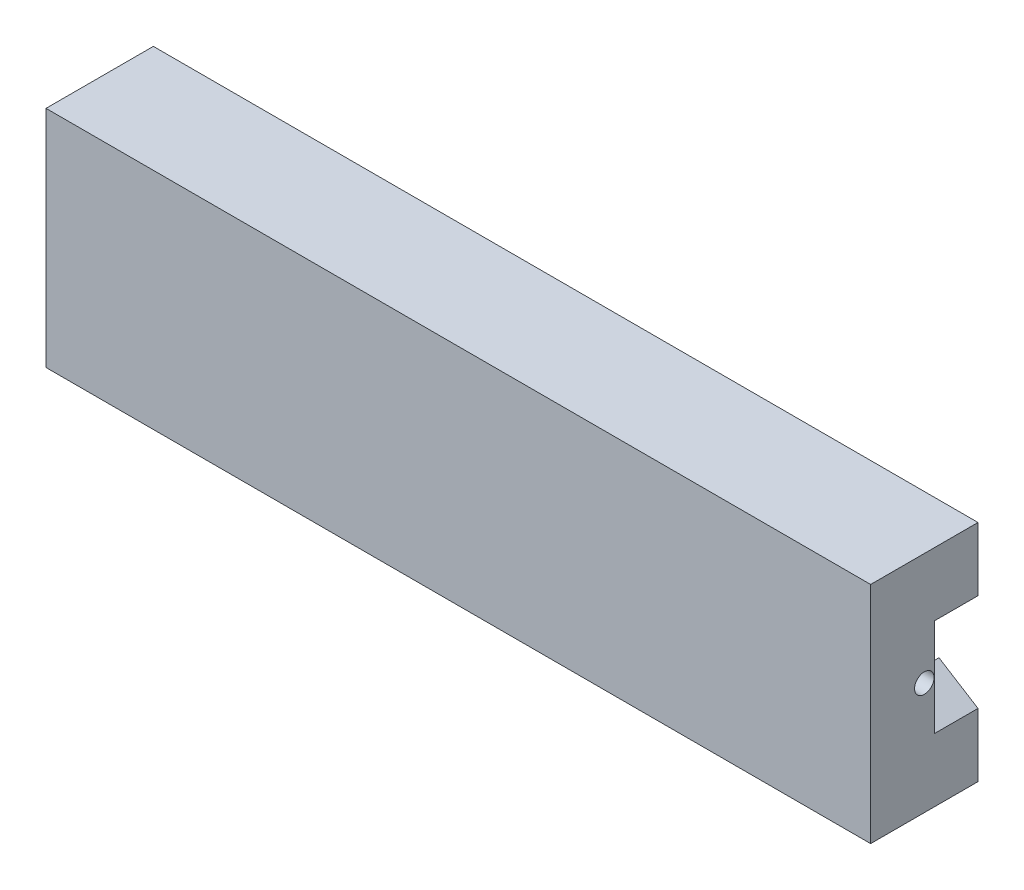
ISO-10303-21;
HEADER;
FILE_DESCRIPTION(('STEP AP214'),'2;1');
FILE_NAME('part.step','',(''),(''),'','','');
FILE_SCHEMA(('AUTOMOTIVE_DESIGN { 1 0 10303 214 1 1 1 1 }'));
ENDSEC;
DATA;
#1=APPLICATION_CONTEXT('core data for automotive mechanical design processes');
#2=APPLICATION_PROTOCOL_DEFINITION('international standard','automotive_design',2000,#1);
#3=PRODUCT_CONTEXT('',#1,'mechanical');
#4=PRODUCT('Part','Part','',(#3));
#5=PRODUCT_RELATED_PRODUCT_CATEGORY('part','',(#4));
#6=PRODUCT_DEFINITION_FORMATION('','',#4);
#7=PRODUCT_DEFINITION_CONTEXT('part definition',#1,'design');
#8=PRODUCT_DEFINITION('design','',#6,#7);
#9=PRODUCT_DEFINITION_SHAPE('','',#8);
#10=(LENGTH_UNIT() NAMED_UNIT(*) SI_UNIT(.MILLI.,.METRE.));
#11=(NAMED_UNIT(*) PLANE_ANGLE_UNIT() SI_UNIT($,.RADIAN.));
#12=(NAMED_UNIT(*) SI_UNIT($,.STERADIAN.) SOLID_ANGLE_UNIT());
#13=UNCERTAINTY_MEASURE_WITH_UNIT(LENGTH_MEASURE(1.E-05),#10,'distance_accuracy_value','');
#14=(GEOMETRIC_REPRESENTATION_CONTEXT(3) GLOBAL_UNCERTAINTY_ASSIGNED_CONTEXT((#13)) GLOBAL_UNIT_ASSIGNED_CONTEXT((#10,
#11,#12)) REPRESENTATION_CONTEXT('',''));
#15=CARTESIAN_POINT('',(0.,0.,0.));
#16=DIRECTION('',(0.,0.,1.));
#17=DIRECTION('',(1.,0.,0.));
#18=AXIS2_PLACEMENT_3D('',#15,#16,#17);
#19=CARTESIAN_POINT('',(38.25,7.5,-2.));
#20=DIRECTION('',(-1.,0.,0.));
#21=DIRECTION('',(0.,0.,1.));
#22=AXIS2_PLACEMENT_3D('',#19,#20,#21);
#23=PLANE('',#22);
#24=DIRECTION('',(0.,0.,-1.));
#25=VECTOR('',#24,1.);
#26=CARTESIAN_POINT('',(38.25,2.5,11.250329614269));
#27=LINE('',#26,#25);
#28=CARTESIAN_POINT('',(38.25,2.5,0.));
#29=VERTEX_POINT('',#28);
#30=CARTESIAN_POINT('',(38.25,2.5,-1.55));
#31=VERTEX_POINT('',#30);
#32=EDGE_CURVE('E541',#29,#31,#27,.T.);
#33=ORIENTED_EDGE('',*,*,#32,.F.);
#34=DIRECTION('',(0.,-1.,0.));
#35=VECTOR('',#34,1.);
#36=CARTESIAN_POINT('',(38.25,7.5,0.));
#37=LINE('',#36,#35);
#38=CARTESIAN_POINT('',(38.25,7.5,0.));
#39=VERTEX_POINT('',#38);
#40=EDGE_CURVE('E360',#39,#29,#37,.T.);
#41=ORIENTED_EDGE('',*,*,#40,.F.);
#42=DIRECTION('',(0.,0.,1.));
#43=VECTOR('',#42,1.);
#44=CARTESIAN_POINT('',(38.25,7.5,-2.));
#45=LINE('',#44,#43);
#46=CARTESIAN_POINT('',(38.25,7.5,-1.55));
#47=VERTEX_POINT('',#46);
#48=EDGE_CURVE('E365',#47,#39,#45,.T.);
#49=ORIENTED_EDGE('',*,*,#48,.F.);
#50=DIRECTION('',(0.,-1.,0.));
#51=VECTOR('',#50,1.);
#52=CARTESIAN_POINT('',(38.25,7.5,-1.55));
#53=LINE('',#52,#51);
#54=EDGE_CURVE('E309',#47,#31,#53,.T.);
#55=ORIENTED_EDGE('',*,*,#54,.T.);
#56=EDGE_LOOP('',(#33,#41,#49,#55));
#57=FACE_BOUND('',#56,.T.);
#58=ADVANCED_FACE('F38',(#57),#23,.T.);
#59=CARTESIAN_POINT('',(38.75,0.,0.48));
#60=DIRECTION('',(1.,0.,0.));
#61=DIRECTION('',(0.,0.,-1.));
#62=AXIS2_PLACEMENT_3D('',#59,#60,#61);
#63=PLANE('',#62);
#64=DIRECTION('',(0.,-1.,0.));
#65=VECTOR('',#64,1.);
#66=CARTESIAN_POINT('',(38.75,0.,0.));
#67=LINE('',#66,#65);
#68=CARTESIAN_POINT('',(38.75,8.,0.));
#69=VERTEX_POINT('',#68);
#70=CARTESIAN_POINT('',(38.75,2.8125,0.));
#71=VERTEX_POINT('',#70);
#72=EDGE_CURVE('E398',#69,#71,#67,.T.);
#73=ORIENTED_EDGE('',*,*,#72,.T.);
#74=DIRECTION('',(0.,0.,1.));
#75=VECTOR('',#74,1.);
#76=CARTESIAN_POINT('',(38.75,2.8125,0.48));
#77=LINE('',#76,#75);
#78=CARTESIAN_POINT('',(38.75,2.8125,0.48));
#79=VERTEX_POINT('',#78);
#80=EDGE_CURVE('E505',#71,#79,#77,.T.);
#81=ORIENTED_EDGE('',*,*,#80,.T.);
#82=DIRECTION('',(0.,-1.,0.));
#83=VECTOR('',#82,1.);
#84=CARTESIAN_POINT('',(38.75,0.,0.48));
#85=LINE('',#84,#83);
#86=CARTESIAN_POINT('',(38.75,8.,0.48));
#87=VERTEX_POINT('',#86);
#88=EDGE_CURVE('E385',#87,#79,#85,.T.);
#89=ORIENTED_EDGE('',*,*,#88,.F.);
#90=DIRECTION('',(0.,0.,-1.));
#91=VECTOR('',#90,1.);
#92=CARTESIAN_POINT('',(38.75,8.,0.48));
#93=LINE('',#92,#91);
#94=EDGE_CURVE('E394',#87,#69,#93,.T.);
#95=ORIENTED_EDGE('',*,*,#94,.T.);
#96=EDGE_LOOP('',(#73,#81,#89,#95));
#97=FACE_BOUND('',#96,.T.);
#98=ADVANCED_FACE('F554',(#97),#63,.F.);
#99=CARTESIAN_POINT('',(38.75,8.,-1.55));
#100=DIRECTION('',(1.,0.,0.));
#101=DIRECTION('',(0.,0.,-1.));
#102=AXIS2_PLACEMENT_3D('',#99,#100,#101);
#103=PLANE('',#102);
#104=DIRECTION('',(0.,-1.,0.));
#105=VECTOR('',#104,1.);
#106=CARTESIAN_POINT('',(38.75,8.,-2.));
#107=LINE('',#106,#105);
#108=CARTESIAN_POINT('',(38.75,8.,-2.));
#109=VERTEX_POINT('',#108);
#110=CARTESIAN_POINT('',(38.75,2.8125,-2.));
#111=VERTEX_POINT('',#110);
#112=EDGE_CURVE('E327',#109,#111,#107,.T.);
#113=ORIENTED_EDGE('',*,*,#112,.T.);
#114=DIRECTION('',(0.,0.,1.));
#115=VECTOR('',#114,1.);
#116=CARTESIAN_POINT('',(38.75,2.8125,-1.55));
#117=LINE('',#116,#115);
#118=CARTESIAN_POINT('',(38.75,2.8125,-1.55));
#119=VERTEX_POINT('',#118);
#120=EDGE_CURVE('E523',#111,#119,#117,.T.);
#121=ORIENTED_EDGE('',*,*,#120,.T.);
#122=DIRECTION('',(0.,-1.,0.));
#123=VECTOR('',#122,1.);
#124=CARTESIAN_POINT('',(38.75,8.,-1.55));
#125=LINE('',#124,#123);
#126=CARTESIAN_POINT('',(38.75,8.,-1.55));
#127=VERTEX_POINT('',#126);
#128=EDGE_CURVE('E313',#127,#119,#125,.T.);
#129=ORIENTED_EDGE('',*,*,#128,.F.);
#130=DIRECTION('',(0.,0.,-1.));
#131=VECTOR('',#130,1.);
#132=CARTESIAN_POINT('',(38.75,8.,-1.55));
#133=LINE('',#132,#131);
#134=EDGE_CURVE('E339',#127,#109,#133,.T.);
#135=ORIENTED_EDGE('',*,*,#134,.T.);
#136=EDGE_LOOP('',(#113,#121,#129,#135));
#137=FACE_BOUND('',#136,.T.);
#138=ADVANCED_FACE('F628',(#137),#103,.F.);
#139=CARTESIAN_POINT('',(38.25,7.5,-4.));
#140=DIRECTION('',(-1.,0.,0.));
#141=DIRECTION('',(0.,0.,1.));
#142=AXIS2_PLACEMENT_3D('',#139,#140,#141);
#143=PLANE('',#142);
#144=DIRECTION('',(0.,0.,-1.));
#145=VECTOR('',#144,1.);
#146=CARTESIAN_POINT('',(38.25,2.5,-4.));
#147=LINE('',#146,#145);
#148=CARTESIAN_POINT('',(38.25,2.5,-2.));
#149=VERTEX_POINT('',#148);
#150=CARTESIAN_POINT('',(38.25,2.5,-4.));
#151=VERTEX_POINT('',#150);
#152=EDGE_CURVE('E11',#149,#151,#147,.T.);
#153=ORIENTED_EDGE('',*,*,#152,.F.);
#154=DIRECTION('',(0.,-1.,0.));
#155=VECTOR('',#154,1.);
#156=CARTESIAN_POINT('',(38.25,7.5,-2.));
#157=LINE('',#156,#155);
#158=CARTESIAN_POINT('',(38.25,7.5,-2.));
#159=VERTEX_POINT('',#158);
#160=EDGE_CURVE('E483',#159,#149,#157,.T.);
#161=ORIENTED_EDGE('',*,*,#160,.F.);
#162=DIRECTION('',(0.,0.,1.));
#163=VECTOR('',#162,1.);
#164=CARTESIAN_POINT('',(38.25,7.5,-4.));
#165=LINE('',#164,#163);
#166=CARTESIAN_POINT('',(38.25,7.5,-4.));
#167=VERTEX_POINT('',#166);
#168=EDGE_CURVE('E493',#167,#159,#165,.T.);
#169=ORIENTED_EDGE('',*,*,#168,.F.);
#170=DIRECTION('',(0.,-1.,0.));
#171=VECTOR('',#170,1.);
#172=CARTESIAN_POINT('',(38.25,7.5,-4.));
#173=LINE('',#172,#171);
#174=EDGE_CURVE('E494',#167,#151,#173,.T.);
#175=ORIENTED_EDGE('',*,*,#174,.T.);
#176=EDGE_LOOP('',(#153,#161,#169,#175));
#177=FACE_BOUND('',#176,.T.);
#178=ADVANCED_FACE('F649',(#177),#143,.T.);
#179=CARTESIAN_POINT('',(38.25,-7.5,-2.));
#180=DIRECTION('',(0.,1.,0.));
#181=DIRECTION('',(-1.,0.,0.));
#182=AXIS2_PLACEMENT_3D('',#179,#180,#181);
#183=PLANE('',#182);
#184=DIRECTION('',(0.,0.,1.));
#185=VECTOR('',#184,1.);
#186=CARTESIAN_POINT('',(38.25,-7.5,-2.));
#187=LINE('',#186,#185);
#188=CARTESIAN_POINT('',(38.25,-7.5,-1.55));
#189=VERTEX_POINT('',#188);
#190=CARTESIAN_POINT('',(38.25,-7.5,0.));
#191=VERTEX_POINT('',#190);
#192=EDGE_CURVE('E363',#189,#191,#187,.T.);
#193=ORIENTED_EDGE('',*,*,#192,.F.);
#194=DIRECTION('',(-1.,0.,0.));
#195=VECTOR('',#194,1.);
#196=CARTESIAN_POINT('',(38.25,-7.5,-1.55));
#197=LINE('',#196,#195);
#198=CARTESIAN_POINT('',(-38.25,-7.50000000000001,-1.55));
#199=VERTEX_POINT('',#198);
#200=EDGE_CURVE('E300',#189,#199,#197,.T.);
#201=ORIENTED_EDGE('',*,*,#200,.T.);
#202=DIRECTION('',(0.,0.,1.));
#203=VECTOR('',#202,1.);
#204=CARTESIAN_POINT('',(-38.25,-7.50000000000001,-2.));
#205=LINE('',#204,#203);
#206=CARTESIAN_POINT('',(-38.25,-7.50000000000001,0.));
#207=VERTEX_POINT('',#206);
#208=EDGE_CURVE('E369',#199,#207,#205,.T.);
#209=ORIENTED_EDGE('',*,*,#208,.T.);
#210=DIRECTION('',(-1.,0.,0.));
#211=VECTOR('',#210,1.);
#212=CARTESIAN_POINT('',(38.25,-7.5,0.));
#213=LINE('',#212,#211);
#214=EDGE_CURVE('E342',#191,#207,#213,.T.);
#215=ORIENTED_EDGE('',*,*,#214,.F.);
#216=EDGE_LOOP('',(#193,#201,#209,#215));
#217=FACE_BOUND('',#216,.T.);
#218=ADVANCED_FACE('F581',(#217),#183,.T.);
#219=CARTESIAN_POINT('',(-38.25,-7.50000000000001,-2.));
#220=DIRECTION('',(1.,0.,0.));
#221=DIRECTION('',(0.,1.,0.));
#222=AXIS2_PLACEMENT_3D('',#219,#220,#221);
#223=PLANE('',#222);
#224=ORIENTED_EDGE('',*,*,#208,.F.);
#225=DIRECTION('',(0.,1.,0.));
#226=VECTOR('',#225,1.);
#227=CARTESIAN_POINT('',(-38.25,-7.50000000000001,-1.55));
#228=LINE('',#227,#226);
#229=CARTESIAN_POINT('',(-38.25,7.49999999999999,-1.55));
#230=VERTEX_POINT('',#229);
#231=EDGE_CURVE('E303',#199,#230,#228,.T.);
#232=ORIENTED_EDGE('',*,*,#231,.T.);
#233=DIRECTION('',(0.,0.,1.));
#234=VECTOR('',#233,1.);
#235=CARTESIAN_POINT('',(-38.25,7.49999999999999,-2.));
#236=LINE('',#235,#234);
#237=CARTESIAN_POINT('',(-38.25,7.49999999999999,0.));
#238=VERTEX_POINT('',#237);
#239=EDGE_CURVE('E367',#230,#238,#236,.T.);
#240=ORIENTED_EDGE('',*,*,#239,.T.);
#241=DIRECTION('',(0.,1.,0.));
#242=VECTOR('',#241,1.);
#243=CARTESIAN_POINT('',(-38.25,-7.50000000000001,0.));
#244=LINE('',#243,#242);
#245=EDGE_CURVE('E353',#207,#238,#244,.T.);
#246=ORIENTED_EDGE('',*,*,#245,.F.);
#247=EDGE_LOOP('',(#224,#232,#240,#246));
#248=FACE_BOUND('',#247,.T.);
#249=ADVANCED_FACE('F578',(#248),#223,.T.);
#250=CARTESIAN_POINT('',(-38.25,7.49999999999999,-2.));
#251=DIRECTION('',(0.,-1.,0.));
#252=DIRECTION('',(1.,0.,0.));
#253=AXIS2_PLACEMENT_3D('',#250,#251,#252);
#254=PLANE('',#253);
#255=ORIENTED_EDGE('',*,*,#239,.F.);
#256=DIRECTION('',(1.,0.,0.));
#257=VECTOR('',#256,1.);
#258=CARTESIAN_POINT('',(-38.25,7.49999999999999,-1.55));
#259=LINE('',#258,#257);
#260=EDGE_CURVE('E306',#230,#47,#259,.T.);
#261=ORIENTED_EDGE('',*,*,#260,.T.);
#262=ORIENTED_EDGE('',*,*,#48,.T.);
#263=DIRECTION('',(1.,0.,0.));
#264=VECTOR('',#263,1.);
#265=CARTESIAN_POINT('',(-38.25,7.49999999999999,0.));
#266=LINE('',#265,#264);
#267=EDGE_CURVE('E356',#238,#39,#266,.T.);
#268=ORIENTED_EDGE('',*,*,#267,.F.);
#269=EDGE_LOOP('',(#255,#261,#262,#268));
#270=FACE_BOUND('',#269,.T.);
#271=ADVANCED_FACE('F573',(#270),#254,.T.);
#272=DIRECTION('',(0.,0.,-1.));
#273=VECTOR('',#272,1.);
#274=CARTESIAN_POINT('',(38.25,-2.5,11.250329614269));
#275=LINE('',#274,#273);
#276=CARTESIAN_POINT('',(38.25,-2.5,0.));
#277=VERTEX_POINT('',#276);
#278=CARTESIAN_POINT('',(38.25,-2.5,-1.55));
#279=VERTEX_POINT('',#278);
#280=EDGE_CURVE('E266',#277,#279,#275,.T.);
#281=ORIENTED_EDGE('',*,*,#280,.T.);
#282=EDGE_CURVE('E61',#279,#189,#53,.T.);
#283=ORIENTED_EDGE('',*,*,#282,.T.);
#284=ORIENTED_EDGE('',*,*,#192,.T.);
#285=EDGE_CURVE('E359',#277,#191,#37,.T.);
#286=ORIENTED_EDGE('',*,*,#285,.F.);
#287=EDGE_LOOP('',(#281,#283,#284,#286));
#288=FACE_BOUND('',#287,.T.);
#289=ADVANCED_FACE('F584',(#288),#23,.T.);
#290=CARTESIAN_POINT('',(-38.25,7.49999999999999,3.));
#291=DIRECTION('',(1.,0.,0.));
#292=DIRECTION('',(0.,1.,0.));
#293=AXIS2_PLACEMENT_3D('',#290,#291,#292);
#294=PLANE('',#293);
#295=CARTESIAN_POINT('',(-38.25,0.,1.5));
#296=DIRECTION('',(1.,0.,0.));
#297=DIRECTION('',(0.,1.,0.));
#298=AXIS2_PLACEMENT_3D('',#295,#296,#297);
#299=CIRCLE('',#298,1.);
#300=CARTESIAN_POINT('',(-38.25,1.,1.5));
#301=VERTEX_POINT('',#300);
#302=EDGE_CURVE('E426',#301,#301,#299,.T.);
#303=ORIENTED_EDGE('',*,*,#302,.F.);
#304=EDGE_LOOP('',(#303));
#305=FACE_BOUND('',#304,.T.);
#306=DIRECTION('',(0.,0.,-1.));
#307=VECTOR('',#306,1.);
#308=CARTESIAN_POINT('',(-38.25,-7.50000000000001,3.));
#309=LINE('',#308,#307);
#310=CARTESIAN_POINT('',(-38.25,-7.50000000000001,3.));
#311=VERTEX_POINT('',#310);
#312=CARTESIAN_POINT('',(-38.25,-7.50000000000001,0.48));
#313=VERTEX_POINT('',#312);
#314=EDGE_CURVE('E447',#311,#313,#309,.T.);
#315=ORIENTED_EDGE('',*,*,#314,.T.);
#316=DIRECTION('',(0.,-1.,0.));
#317=VECTOR('',#316,1.);
#318=CARTESIAN_POINT('',(-38.25,0.,0.48));
#319=LINE('',#318,#317);
#320=CARTESIAN_POINT('',(-38.25,7.49999999999999,0.48));
#321=VERTEX_POINT('',#320);
#322=EDGE_CURVE('E377',#321,#313,#319,.T.);
#323=ORIENTED_EDGE('',*,*,#322,.F.);
#324=DIRECTION('',(0.,0.,-1.));
#325=VECTOR('',#324,1.);
#326=CARTESIAN_POINT('',(-38.25,7.49999999999999,3.));
#327=LINE('',#326,#325);
#328=CARTESIAN_POINT('',(-38.25,7.49999999999999,3.));
#329=VERTEX_POINT('',#328);
#330=EDGE_CURVE('E438',#329,#321,#327,.T.);
#331=ORIENTED_EDGE('',*,*,#330,.F.);
#332=DIRECTION('',(0.,-1.,0.));
#333=VECTOR('',#332,1.);
#334=CARTESIAN_POINT('',(-38.25,7.49999999999999,3.));
#335=LINE('',#334,#333);
#336=EDGE_CURVE('E429',#329,#311,#335,.T.);
#337=ORIENTED_EDGE('',*,*,#336,.T.);
#338=EDGE_LOOP('',(#315,#323,#331,#337));
#339=FACE_BOUND('',#338,.T.);
#340=ADVANCED_FACE('F633',(#305,#339),#294,.T.);
#341=CARTESIAN_POINT('',(38.25,-7.5,3.));
#342=DIRECTION('',(0.,1.,0.));
#343=DIRECTION('',(-1.,0.,0.));
#344=AXIS2_PLACEMENT_3D('',#341,#342,#343);
#345=PLANE('',#344);
#346=DIRECTION('',(0.,0.,-1.));
#347=VECTOR('',#346,1.);
#348=CARTESIAN_POINT('',(38.25,-7.5,3.));
#349=LINE('',#348,#347);
#350=CARTESIAN_POINT('',(38.25,-7.5,3.));
#351=VERTEX_POINT('',#350);
#352=CARTESIAN_POINT('',(38.25,-7.5,0.48));
#353=VERTEX_POINT('',#352);
#354=EDGE_CURVE('E444',#351,#353,#349,.T.);
#355=ORIENTED_EDGE('',*,*,#354,.T.);
#356=DIRECTION('',(1.,0.,0.));
#357=VECTOR('',#356,1.);
#358=CARTESIAN_POINT('',(0.,-7.5,0.48));
#359=LINE('',#358,#357);
#360=EDGE_CURVE('E379',#313,#353,#359,.T.);
#361=ORIENTED_EDGE('',*,*,#360,.F.);
#362=ORIENTED_EDGE('',*,*,#314,.F.);
#363=DIRECTION('',(1.,0.,0.));
#364=VECTOR('',#363,1.);
#365=CARTESIAN_POINT('',(38.25,-7.5,3.));
#366=LINE('',#365,#364);
#367=EDGE_CURVE('E432',#311,#351,#366,.T.);
#368=ORIENTED_EDGE('',*,*,#367,.T.);
#369=EDGE_LOOP('',(#355,#361,#362,#368));
#370=FACE_BOUND('',#369,.T.);
#371=ADVANCED_FACE('F639',(#370),#345,.T.);
#372=CARTESIAN_POINT('',(38.25,7.5,3.));
#373=DIRECTION('',(-1.,0.,0.));
#374=DIRECTION('',(0.,0.,1.));
#375=AXIS2_PLACEMENT_3D('',#372,#373,#374);
#376=PLANE('',#375);
#377=CARTESIAN_POINT('',(38.25,0.,1.5));
#378=DIRECTION('',(-1.,0.,0.));
#379=DIRECTION('',(0.,0.,1.));
#380=AXIS2_PLACEMENT_3D('',#377,#378,#379);
#381=CIRCLE('',#380,1.);
#382=CARTESIAN_POINT('',(38.25,0.,2.5));
#383=VERTEX_POINT('',#382);
#384=EDGE_CURVE('E423',#383,#383,#381,.T.);
#385=ORIENTED_EDGE('',*,*,#384,.F.);
#386=EDGE_LOOP('',(#385));
#387=FACE_BOUND('',#386,.T.);
#388=DIRECTION('',(0.,0.,-1.));
#389=VECTOR('',#388,1.);
#390=CARTESIAN_POINT('',(38.25,7.5,3.));
#391=LINE('',#390,#389);
#392=CARTESIAN_POINT('',(38.25,7.5,3.));
#393=VERTEX_POINT('',#392);
#394=CARTESIAN_POINT('',(38.25,7.5,0.48));
#395=VERTEX_POINT('',#394);
#396=EDGE_CURVE('E441',#393,#395,#391,.T.);
#397=ORIENTED_EDGE('',*,*,#396,.T.);
#398=DIRECTION('',(0.,1.,0.));
#399=VECTOR('',#398,1.);
#400=CARTESIAN_POINT('',(38.25,0.,0.48));
#401=LINE('',#400,#399);
#402=EDGE_CURVE('E372',#353,#395,#401,.T.);
#403=ORIENTED_EDGE('',*,*,#402,.F.);
#404=ORIENTED_EDGE('',*,*,#354,.F.);
#405=DIRECTION('',(0.,1.,0.));
#406=VECTOR('',#405,1.);
#407=CARTESIAN_POINT('',(38.25,7.5,3.));
#408=LINE('',#407,#406);
#409=EDGE_CURVE('E434',#351,#393,#408,.T.);
#410=ORIENTED_EDGE('',*,*,#409,.T.);
#411=EDGE_LOOP('',(#397,#403,#404,#410));
#412=FACE_BOUND('',#411,.T.);
#413=ADVANCED_FACE('F672',(#387,#412),#376,.T.);
#414=CARTESIAN_POINT('',(38.25,7.5,3.));
#415=DIRECTION('',(0.,-1.,0.));
#416=DIRECTION('',(1.,0.,0.));
#417=AXIS2_PLACEMENT_3D('',#414,#415,#416);
#418=PLANE('',#417);
#419=ORIENTED_EDGE('',*,*,#330,.T.);
#420=DIRECTION('',(-1.,0.,0.));
#421=VECTOR('',#420,1.);
#422=CARTESIAN_POINT('',(0.,7.5,0.48));
#423=LINE('',#422,#421);
#424=EDGE_CURVE('E374',#395,#321,#423,.T.);
#425=ORIENTED_EDGE('',*,*,#424,.F.);
#426=ORIENTED_EDGE('',*,*,#396,.F.);
#427=DIRECTION('',(-1.,0.,0.));
#428=VECTOR('',#427,1.);
#429=CARTESIAN_POINT('',(38.25,7.5,3.));
#430=LINE('',#429,#428);
#431=EDGE_CURVE('E436',#393,#329,#430,.T.);
#432=ORIENTED_EDGE('',*,*,#431,.T.);
#433=EDGE_LOOP('',(#419,#425,#426,#432));
#434=FACE_BOUND('',#433,.T.);
#435=ADVANCED_FACE('F669',(#434),#418,.T.);
#436=CARTESIAN_POINT('',(42.25,-11.5,98.574254207501));
#437=DIRECTION('',(0.,-1.,0.));
#438=DIRECTION('',(1.,0.,0.));
#439=AXIS2_PLACEMENT_3D('',#436,#437,#438);
#440=PLANE('',#439);
#441=DIRECTION('',(1.,0.,0.));
#442=VECTOR('',#441,1.);
#443=CARTESIAN_POINT('',(42.25,-11.5,7.00000000000001));
#444=LINE('',#443,#442);
#445=CARTESIAN_POINT('',(-42.25,-11.5,7.00000000000001));
#446=VERTEX_POINT('',#445);
#447=CARTESIAN_POINT('',(42.25,-11.5,7.00000000000001));
#448=VERTEX_POINT('',#447);
#449=EDGE_CURVE('E455',#446,#448,#444,.T.);
#450=ORIENTED_EDGE('',*,*,#449,.F.);
#451=DIRECTION('',(0.,0.,-1.));
#452=VECTOR('',#451,1.);
#453=CARTESIAN_POINT('',(-42.25,-11.5,98.574254207501));
#454=LINE('',#453,#452);
#455=CARTESIAN_POINT('',(-42.25,-11.5,-4.));
#456=VERTEX_POINT('',#455);
#457=EDGE_CURVE('E450',#446,#456,#454,.T.);
#458=ORIENTED_EDGE('',*,*,#457,.T.);
#459=DIRECTION('',(-1.,0.,0.));
#460=VECTOR('',#459,1.);
#461=CARTESIAN_POINT('',(42.25,-11.5,-4.));
#462=LINE('',#461,#460);
#463=CARTESIAN_POINT('',(42.25,-11.5,-4.));
#464=VERTEX_POINT('',#463);
#465=EDGE_CURVE('E290',#464,#456,#462,.T.);
#466=ORIENTED_EDGE('',*,*,#465,.F.);
#467=DIRECTION('',(0.,0.,-1.));
#468=VECTOR('',#467,1.);
#469=CARTESIAN_POINT('',(42.25,-11.5,98.574254207501));
#470=LINE('',#469,#468);
#471=EDGE_CURVE('E284',#448,#464,#470,.T.);
#472=ORIENTED_EDGE('',*,*,#471,.F.);
#473=EDGE_LOOP('',(#450,#458,#466,#472));
#474=FACE_BOUND('',#473,.T.);
#475=ADVANCED_FACE('F40',(#474),#440,.T.);
#476=CARTESIAN_POINT('',(42.25,11.5,98.574254207501));
#477=DIRECTION('',(1.,0.,0.));
#478=DIRECTION('',(0.,0.,-1.));
#479=AXIS2_PLACEMENT_3D('',#476,#477,#478);
#480=PLANE('',#479);
#481=DIRECTION('',(0.,0.,-1.));
#482=VECTOR('',#481,1.);
#483=CARTESIAN_POINT('',(42.25,5.,11.250329614269));
#484=LINE('',#483,#482);
#485=CARTESIAN_POINT('',(42.25,5.,0.48));
#486=VERTEX_POINT('',#485);
#487=CARTESIAN_POINT('',(42.25,5.,-4.));
#488=VERTEX_POINT('',#487);
#489=EDGE_CURVE('E543',#486,#488,#484,.T.);
#490=ORIENTED_EDGE('',*,*,#489,.T.);
#491=DIRECTION('',(0.,-1.,0.));
#492=VECTOR('',#491,1.);
#493=CARTESIAN_POINT('',(42.25,11.5,-4.));
#494=LINE('',#493,#492);
#495=CARTESIAN_POINT('',(42.25,11.5,-4.));
#496=VERTEX_POINT('',#495);
#497=EDGE_CURVE('E286',#496,#488,#494,.T.);
#498=ORIENTED_EDGE('',*,*,#497,.F.);
#499=DIRECTION('',(0.,0.,-1.));
#500=VECTOR('',#499,1.);
#501=CARTESIAN_POINT('',(42.25,11.5,98.574254207501));
#502=LINE('',#501,#500);
#503=CARTESIAN_POINT('',(42.25,11.5,7.00000000000001));
#504=VERTEX_POINT('',#503);
#505=EDGE_CURVE('E459',#504,#496,#502,.T.);
#506=ORIENTED_EDGE('',*,*,#505,.F.);
#507=DIRECTION('',(0.,1.,0.));
#508=VECTOR('',#507,1.);
#509=CARTESIAN_POINT('',(42.25,11.5,7.00000000000001));
#510=LINE('',#509,#508);
#511=EDGE_CURVE('E453',#448,#504,#510,.T.);
#512=ORIENTED_EDGE('',*,*,#511,.F.);
#513=ORIENTED_EDGE('',*,*,#471,.T.);
#514=CARTESIAN_POINT('',(42.25,-5.,-4.));
#515=VERTEX_POINT('',#514);
#516=EDGE_CURVE('E274',#515,#464,#494,.T.);
#517=ORIENTED_EDGE('',*,*,#516,.F.);
#518=DIRECTION('',(0.,0.,-1.));
#519=VECTOR('',#518,1.);
#520=CARTESIAN_POINT('',(42.25,-5.,11.250329614269));
#521=LINE('',#520,#519);
#522=CARTESIAN_POINT('',(42.25,-5.,0.48));
#523=VERTEX_POINT('',#522);
#524=EDGE_CURVE('E258',#523,#515,#521,.T.);
#525=ORIENTED_EDGE('',*,*,#524,.F.);
#526=DIRECTION('',(0.,1.,0.));
#527=VECTOR('',#526,1.);
#528=CARTESIAN_POINT('',(42.25,5.,0.48));
#529=LINE('',#528,#527);
#530=EDGE_CURVE('E538',#523,#486,#529,.T.);
#531=ORIENTED_EDGE('',*,*,#530,.T.);
#532=EDGE_LOOP('',(#490,#498,#506,#512,#513,#517,#525,#531));
#533=FACE_BOUND('',#532,.T.);
#534=CARTESIAN_POINT('',(42.25,0.,1.5));
#535=DIRECTION('',(-1.,0.,0.));
#536=DIRECTION('',(0.,0.,1.));
#537=AXIS2_PLACEMENT_3D('',#534,#535,#536);
#538=CIRCLE('',#537,1.);
#539=CARTESIAN_POINT('',(42.25,0.,2.5));
#540=VERTEX_POINT('',#539);
#541=EDGE_CURVE('E420',#540,#540,#538,.T.);
#542=ORIENTED_EDGE('',*,*,#541,.T.);
#543=EDGE_LOOP('',(#542));
#544=FACE_BOUND('',#543,.T.);
#545=ADVANCED_FACE('F280',(#533,#544),#480,.T.);
#546=CARTESIAN_POINT('',(-42.25,11.5,98.574254207501));
#547=DIRECTION('',(0.,1.,0.));
#548=DIRECTION('',(-1.,0.,0.));
#549=AXIS2_PLACEMENT_3D('',#546,#547,#548);
#550=PLANE('',#549);
#551=DIRECTION('',(-1.,0.,0.));
#552=VECTOR('',#551,1.);
#553=CARTESIAN_POINT('',(-42.25,11.5,7.00000000000001));
#554=LINE('',#553,#552);
#555=CARTESIAN_POINT('',(-42.25,11.5,7.00000000000001));
#556=VERTEX_POINT('',#555);
#557=EDGE_CURVE('E451',#504,#556,#554,.T.);
#558=ORIENTED_EDGE('',*,*,#557,.F.);
#559=ORIENTED_EDGE('',*,*,#505,.T.);
#560=DIRECTION('',(1.,0.,0.));
#561=VECTOR('',#560,1.);
#562=CARTESIAN_POINT('',(-42.25,11.5,-4.));
#563=LINE('',#562,#561);
#564=CARTESIAN_POINT('',(-42.25,11.5,-4.));
#565=VERTEX_POINT('',#564);
#566=EDGE_CURVE('E287',#565,#496,#563,.T.);
#567=ORIENTED_EDGE('',*,*,#566,.F.);
#568=DIRECTION('',(0.,0.,-1.));
#569=VECTOR('',#568,1.);
#570=CARTESIAN_POINT('',(-42.25,11.5,98.574254207501));
#571=LINE('',#570,#569);
#572=EDGE_CURVE('E461',#556,#565,#571,.T.);
#573=ORIENTED_EDGE('',*,*,#572,.F.);
#574=EDGE_LOOP('',(#558,#559,#567,#573));
#575=FACE_BOUND('',#574,.T.);
#576=ADVANCED_FACE('F599',(#575),#550,.T.);
#577=CARTESIAN_POINT('',(-42.25,-11.5,98.574254207501));
#578=DIRECTION('',(-1.,0.,0.));
#579=DIRECTION('',(0.,-1.,0.));
#580=AXIS2_PLACEMENT_3D('',#577,#578,#579);
#581=PLANE('',#580);
#582=CARTESIAN_POINT('',(-42.25,0.,1.5));
#583=DIRECTION('',(-1.,0.,0.));
#584=DIRECTION('',(0.,0.,1.));
#585=AXIS2_PLACEMENT_3D('',#582,#583,#584);
#586=CIRCLE('',#585,1.);
#587=CARTESIAN_POINT('',(-42.25,0.,2.5));
#588=VERTEX_POINT('',#587);
#589=EDGE_CURVE('E409',#588,#588,#586,.T.);
#590=ORIENTED_EDGE('',*,*,#589,.F.);
#591=EDGE_LOOP('',(#590));
#592=FACE_BOUND('',#591,.T.);
#593=DIRECTION('',(0.,-1.,0.));
#594=VECTOR('',#593,1.);
#595=CARTESIAN_POINT('',(-42.25,-11.5,7.00000000000001));
#596=LINE('',#595,#594);
#597=EDGE_CURVE('E457',#556,#446,#596,.T.);
#598=ORIENTED_EDGE('',*,*,#597,.F.);
#599=ORIENTED_EDGE('',*,*,#572,.T.);
#600=DIRECTION('',(0.,1.,0.));
#601=VECTOR('',#600,1.);
#602=CARTESIAN_POINT('',(-42.25,-11.5,-4.));
#603=LINE('',#602,#601);
#604=EDGE_CURVE('E297',#456,#565,#603,.T.);
#605=ORIENTED_EDGE('',*,*,#604,.F.);
#606=ORIENTED_EDGE('',*,*,#457,.F.);
#607=EDGE_LOOP('',(#598,#599,#605,#606));
#608=FACE_BOUND('',#607,.T.);
#609=ADVANCED_FACE('F606',(#592,#608),#581,.T.);
#610=CARTESIAN_POINT('',(0.,0.,7.));
#611=DIRECTION('',(0.,0.,-1.));
#612=DIRECTION('',(-1.,0.,0.));
#613=AXIS2_PLACEMENT_3D('',#610,#611,#612);
#614=PLANE('',#613);
#615=ORIENTED_EDGE('',*,*,#449,.T.);
#616=ORIENTED_EDGE('',*,*,#511,.T.);
#617=ORIENTED_EDGE('',*,*,#557,.T.);
#618=ORIENTED_EDGE('',*,*,#597,.T.);
#619=EDGE_LOOP('',(#615,#616,#617,#618));
#620=FACE_BOUND('',#619,.T.);
#621=ADVANCED_FACE('F607',(#620),#614,.F.);
#622=CARTESIAN_POINT('',(0.,0.,3.));
#623=DIRECTION('',(0.,0.,-1.));
#624=DIRECTION('',(-1.,0.,0.));
#625=AXIS2_PLACEMENT_3D('',#622,#623,#624);
#626=PLANE('',#625);
#627=ORIENTED_EDGE('',*,*,#336,.F.);
#628=ORIENTED_EDGE('',*,*,#431,.F.);
#629=ORIENTED_EDGE('',*,*,#409,.F.);
#630=ORIENTED_EDGE('',*,*,#367,.F.);
#631=EDGE_LOOP('',(#627,#628,#629,#630));
#632=FACE_BOUND('',#631,.T.);
#633=ADVANCED_FACE('F609',(#632),#626,.T.);
#634=CARTESIAN_POINT('',(42.25,0.,1.5));
#635=DIRECTION('',(-1.,0.,0.));
#636=DIRECTION('',(0.,0.,1.));
#637=AXIS2_PLACEMENT_3D('',#634,#635,#636);
#638=CYLINDRICAL_SURFACE('',#637,1.);
#639=ORIENTED_EDGE('',*,*,#384,.T.);
#640=EDGE_LOOP('',(#639));
#641=FACE_BOUND('',#640,.T.);
#642=ORIENTED_EDGE('',*,*,#541,.F.);
#643=EDGE_LOOP('',(#642));
#644=FACE_BOUND('',#643,.T.);
#645=ADVANCED_FACE('F616',(#641,#644),#638,.F.);
#646=ORIENTED_EDGE('',*,*,#302,.T.);
#647=EDGE_LOOP('',(#646));
#648=FACE_BOUND('',#647,.T.);
#649=ORIENTED_EDGE('',*,*,#589,.T.);
#650=EDGE_LOOP('',(#649));
#651=FACE_BOUND('',#650,.T.);
#652=ADVANCED_FACE('F666',(#648,#651),#638,.F.);
#653=CARTESIAN_POINT('',(0.,8.,0.48));
#654=DIRECTION('',(0.,1.,0.));
#655=DIRECTION('',(-1.,0.,0.));
#656=AXIS2_PLACEMENT_3D('',#653,#654,#655);
#657=PLANE('',#656);
#658=DIRECTION('',(1.,0.,0.));
#659=VECTOR('',#658,1.);
#660=CARTESIAN_POINT('',(0.,8.,0.));
#661=LINE('',#660,#659);
#662=CARTESIAN_POINT('',(-38.75,7.99999999999999,0.));
#663=VERTEX_POINT('',#662);
#664=EDGE_CURVE('E371',#663,#69,#661,.T.);
#665=ORIENTED_EDGE('',*,*,#664,.T.);
#666=ORIENTED_EDGE('',*,*,#94,.F.);
#667=DIRECTION('',(1.,0.,0.));
#668=VECTOR('',#667,1.);
#669=CARTESIAN_POINT('',(0.,8.,0.48));
#670=LINE('',#669,#668);
#671=CARTESIAN_POINT('',(-38.75,7.99999999999999,0.48));
#672=VERTEX_POINT('',#671);
#673=EDGE_CURVE('E381',#672,#87,#670,.T.);
#674=ORIENTED_EDGE('',*,*,#673,.F.);
#675=DIRECTION('',(0.,0.,-1.));
#676=VECTOR('',#675,1.);
#677=CARTESIAN_POINT('',(-38.75,7.99999999999999,0.48));
#678=LINE('',#677,#676);
#679=EDGE_CURVE('E406',#672,#663,#678,.T.);
#680=ORIENTED_EDGE('',*,*,#679,.T.);
#681=EDGE_LOOP('',(#665,#666,#674,#680));
#682=FACE_BOUND('',#681,.T.);
#683=ADVANCED_FACE('F560',(#682),#657,.F.);
#684=CARTESIAN_POINT('',(-38.75,0.,0.48));
#685=DIRECTION('',(-1.,0.,0.));
#686=DIRECTION('',(0.,-1.,0.));
#687=AXIS2_PLACEMENT_3D('',#684,#685,#686);
#688=PLANE('',#687);
#689=DIRECTION('',(0.,1.,0.));
#690=VECTOR('',#689,1.);
#691=CARTESIAN_POINT('',(-38.75,0.,0.));
#692=LINE('',#691,#690);
#693=CARTESIAN_POINT('',(-38.75,-8.00000000000001,0.));
#694=VERTEX_POINT('',#693);
#695=EDGE_CURVE('E375',#694,#663,#692,.T.);
#696=ORIENTED_EDGE('',*,*,#695,.T.);
#697=ORIENTED_EDGE('',*,*,#679,.F.);
#698=DIRECTION('',(0.,1.,0.));
#699=VECTOR('',#698,1.);
#700=CARTESIAN_POINT('',(-38.75,0.,0.48));
#701=LINE('',#700,#699);
#702=CARTESIAN_POINT('',(-38.75,-8.00000000000001,0.48));
#703=VERTEX_POINT('',#702);
#704=EDGE_CURVE('E391',#703,#672,#701,.T.);
#705=ORIENTED_EDGE('',*,*,#704,.F.);
#706=DIRECTION('',(0.,0.,-1.));
#707=VECTOR('',#706,1.);
#708=CARTESIAN_POINT('',(-38.75,-8.00000000000001,0.48));
#709=LINE('',#708,#707);
#710=EDGE_CURVE('E410',#703,#694,#709,.T.);
#711=ORIENTED_EDGE('',*,*,#710,.T.);
#712=EDGE_LOOP('',(#696,#697,#705,#711));
#713=FACE_BOUND('',#712,.T.);
#714=ADVANCED_FACE('F655',(#713),#688,.F.);
#715=CARTESIAN_POINT('',(0.,-8.,0.48));
#716=DIRECTION('',(0.,-1.,0.));
#717=DIRECTION('',(1.,0.,0.));
#718=AXIS2_PLACEMENT_3D('',#715,#716,#717);
#719=PLANE('',#718);
#720=DIRECTION('',(-1.,0.,0.));
#721=VECTOR('',#720,1.);
#722=CARTESIAN_POINT('',(0.,-8.,0.));
#723=LINE('',#722,#721);
#724=CARTESIAN_POINT('',(38.75,-8.,0.));
#725=VERTEX_POINT('',#724);
#726=EDGE_CURVE('E401',#725,#694,#723,.T.);
#727=ORIENTED_EDGE('',*,*,#726,.T.);
#728=ORIENTED_EDGE('',*,*,#710,.F.);
#729=DIRECTION('',(-1.,0.,0.));
#730=VECTOR('',#729,1.);
#731=CARTESIAN_POINT('',(0.,-8.,0.48));
#732=LINE('',#731,#730);
#733=CARTESIAN_POINT('',(38.75,-8.,0.48));
#734=VERTEX_POINT('',#733);
#735=EDGE_CURVE('E388',#734,#703,#732,.T.);
#736=ORIENTED_EDGE('',*,*,#735,.F.);
#737=DIRECTION('',(0.,0.,-1.));
#738=VECTOR('',#737,1.);
#739=CARTESIAN_POINT('',(38.75,-8.,0.48));
#740=LINE('',#739,#738);
#741=EDGE_CURVE('E413',#734,#725,#740,.T.);
#742=ORIENTED_EDGE('',*,*,#741,.T.);
#743=EDGE_LOOP('',(#727,#728,#736,#742));
#744=FACE_BOUND('',#743,.T.);
#745=ADVANCED_FACE('F658',(#744),#719,.F.);
#746=CARTESIAN_POINT('',(38.75,-2.8125,0.48));
#747=VERTEX_POINT('',#746);
#748=EDGE_CURVE('E384',#747,#734,#85,.T.);
#749=ORIENTED_EDGE('',*,*,#748,.F.);
#750=DIRECTION('',(0.,0.,-1.));
#751=VECTOR('',#750,1.);
#752=CARTESIAN_POINT('',(38.75,-2.8125,0.48));
#753=LINE('',#752,#751);
#754=CARTESIAN_POINT('',(38.75,-2.8125,0.));
#755=VERTEX_POINT('',#754);
#756=EDGE_CURVE('E529',#747,#755,#753,.T.);
#757=ORIENTED_EDGE('',*,*,#756,.T.);
#758=EDGE_CURVE('E397',#755,#725,#67,.T.);
#759=ORIENTED_EDGE('',*,*,#758,.T.);
#760=ORIENTED_EDGE('',*,*,#741,.F.);
#761=EDGE_LOOP('',(#749,#757,#759,#760));
#762=FACE_BOUND('',#761,.T.);
#763=ADVANCED_FACE('F588',(#762),#63,.F.);
#764=CARTESIAN_POINT('',(0.,0.,0.48));
#765=DIRECTION('',(0.,0.,-1.));
#766=DIRECTION('',(-1.,0.,0.));
#767=AXIS2_PLACEMENT_3D('',#764,#765,#766);
#768=PLANE('',#767);
#769=ORIENTED_EDGE('',*,*,#88,.T.);
#770=DIRECTION('',(-0.847998304005088,-0.52999894000318,0.));
#771=VECTOR('',#770,1.);
#772=CARTESIAN_POINT('',(38.25,2.5,0.48));
#773=LINE('',#772,#771);
#774=EDGE_CURVE('E545',#486,#79,#773,.T.);
#775=ORIENTED_EDGE('',*,*,#774,.F.);
#776=ORIENTED_EDGE('',*,*,#530,.F.);
#777=DIRECTION('',(0.847998304005088,-0.52999894000318,0.));
#778=VECTOR('',#777,1.);
#779=CARTESIAN_POINT('',(42.25,-5.,0.48));
#780=LINE('',#779,#778);
#781=EDGE_CURVE('E261',#747,#523,#780,.T.);
#782=ORIENTED_EDGE('',*,*,#781,.F.);
#783=ORIENTED_EDGE('',*,*,#748,.T.);
#784=ORIENTED_EDGE('',*,*,#735,.T.);
#785=ORIENTED_EDGE('',*,*,#704,.T.);
#786=ORIENTED_EDGE('',*,*,#673,.T.);
#787=EDGE_LOOP('',(#769,#775,#776,#782,#783,#784,#785,#786));
#788=FACE_BOUND('',#787,.T.);
#789=ORIENTED_EDGE('',*,*,#402,.T.);
#790=ORIENTED_EDGE('',*,*,#424,.T.);
#791=ORIENTED_EDGE('',*,*,#322,.T.);
#792=ORIENTED_EDGE('',*,*,#360,.T.);
#793=EDGE_LOOP('',(#789,#790,#791,#792));
#794=FACE_BOUND('',#793,.T.);
#795=ADVANCED_FACE('F555',(#788,#794),#768,.T.);
#796=CARTESIAN_POINT('',(0.,0.,0.));
#797=DIRECTION('',(0.,0.,-1.));
#798=DIRECTION('',(-1.,0.,0.));
#799=AXIS2_PLACEMENT_3D('',#796,#797,#798);
#800=PLANE('',#799);
#801=ORIENTED_EDGE('',*,*,#40,.T.);
#802=DIRECTION('',(0.847998304005088,0.52999894000318,0.));
#803=VECTOR('',#802,1.);
#804=CARTESIAN_POINT('',(9.62078651685392,-15.3932584269663,0.));
#805=LINE('',#804,#803);
#806=EDGE_CURVE('E508',#29,#71,#805,.T.);
#807=ORIENTED_EDGE('',*,*,#806,.T.);
#808=ORIENTED_EDGE('',*,*,#72,.F.);
#809=ORIENTED_EDGE('',*,*,#664,.F.);
#810=ORIENTED_EDGE('',*,*,#695,.F.);
#811=ORIENTED_EDGE('',*,*,#726,.F.);
#812=ORIENTED_EDGE('',*,*,#758,.F.);
#813=DIRECTION('',(-0.847998304005088,0.52999894000318,0.));
#814=VECTOR('',#813,1.);
#815=CARTESIAN_POINT('',(9.62078651685392,15.3932584269663,0.));
#816=LINE('',#815,#814);
#817=EDGE_CURVE('E532',#755,#277,#816,.T.);
#818=ORIENTED_EDGE('',*,*,#817,.T.);
#819=ORIENTED_EDGE('',*,*,#285,.T.);
#820=ORIENTED_EDGE('',*,*,#214,.T.);
#821=ORIENTED_EDGE('',*,*,#245,.T.);
#822=ORIENTED_EDGE('',*,*,#267,.T.);
#823=EDGE_LOOP('',(#801,#807,#808,#809,#810,#811,#812,#818,#819,#820,#821,#822));
#824=FACE_BOUND('',#823,.T.);
#825=ADVANCED_FACE('F562',(#824),#800,.F.);
#826=CARTESIAN_POINT('',(38.75,-2.8125,-1.55));
#827=VERTEX_POINT('',#826);
#828=CARTESIAN_POINT('',(38.75,-8.,-1.55));
#829=VERTEX_POINT('',#828);
#830=EDGE_CURVE('E317',#827,#829,#125,.T.);
#831=ORIENTED_EDGE('',*,*,#830,.F.);
#832=DIRECTION('',(0.,0.,-1.));
#833=VECTOR('',#832,1.);
#834=CARTESIAN_POINT('',(38.75,-2.8125,-1.55));
#835=LINE('',#834,#833);
#836=CARTESIAN_POINT('',(38.75,-2.8125,-2.));
#837=VERTEX_POINT('',#836);
#838=EDGE_CURVE('E477',#827,#837,#835,.T.);
#839=ORIENTED_EDGE('',*,*,#838,.T.);
#840=CARTESIAN_POINT('',(38.75,-8.,-2.));
#841=VERTEX_POINT('',#840);
#842=EDGE_CURVE('E312',#837,#841,#107,.T.);
#843=ORIENTED_EDGE('',*,*,#842,.T.);
#844=DIRECTION('',(0.,0.,-1.));
#845=VECTOR('',#844,1.);
#846=CARTESIAN_POINT('',(38.75,-8.,-1.55));
#847=LINE('',#846,#845);
#848=EDGE_CURVE('E326',#829,#841,#847,.T.);
#849=ORIENTED_EDGE('',*,*,#848,.F.);
#850=EDGE_LOOP('',(#831,#839,#843,#849));
#851=FACE_BOUND('',#850,.T.);
#852=ADVANCED_FACE('F652',(#851),#103,.F.);
#853=CARTESIAN_POINT('',(-38.75,7.99999999999999,-1.55));
#854=DIRECTION('',(0.,1.,0.));
#855=DIRECTION('',(-1.,0.,0.));
#856=AXIS2_PLACEMENT_3D('',#853,#854,#855);
#857=PLANE('',#856);
#858=DIRECTION('',(1.,0.,0.));
#859=VECTOR('',#858,1.);
#860=CARTESIAN_POINT('',(-38.75,7.99999999999999,-2.));
#861=LINE('',#860,#859);
#862=CARTESIAN_POINT('',(-38.75,7.99999999999999,-2.));
#863=VERTEX_POINT('',#862);
#864=EDGE_CURVE('E336',#863,#109,#861,.T.);
#865=ORIENTED_EDGE('',*,*,#864,.T.);
#866=ORIENTED_EDGE('',*,*,#134,.F.);
#867=DIRECTION('',(1.,0.,0.));
#868=VECTOR('',#867,1.);
#869=CARTESIAN_POINT('',(-38.75,7.99999999999999,-1.55));
#870=LINE('',#869,#868);
#871=CARTESIAN_POINT('',(-38.75,7.99999999999999,-1.55));
#872=VERTEX_POINT('',#871);
#873=EDGE_CURVE('E323',#872,#127,#870,.T.);
#874=ORIENTED_EDGE('',*,*,#873,.F.);
#875=DIRECTION('',(0.,0.,-1.));
#876=VECTOR('',#875,1.);
#877=CARTESIAN_POINT('',(-38.75,7.99999999999999,-1.55));
#878=LINE('',#877,#876);
#879=EDGE_CURVE('E343',#872,#863,#878,.T.);
#880=ORIENTED_EDGE('',*,*,#879,.T.);
#881=EDGE_LOOP('',(#865,#866,#874,#880));
#882=FACE_BOUND('',#881,.T.);
#883=ADVANCED_FACE('F773',(#882),#857,.F.);
#884=CARTESIAN_POINT('',(-38.75,-8.00000000000001,-1.55));
#885=DIRECTION('',(-1.,0.,0.));
#886=DIRECTION('',(0.,-1.,0.));
#887=AXIS2_PLACEMENT_3D('',#884,#885,#886);
#888=PLANE('',#887);
#889=DIRECTION('',(0.,1.,0.));
#890=VECTOR('',#889,1.);
#891=CARTESIAN_POINT('',(-38.75,-8.00000000000001,-2.));
#892=LINE('',#891,#890);
#893=CARTESIAN_POINT('',(-38.75,-8.00000000000001,-2.));
#894=VERTEX_POINT('',#893);
#895=EDGE_CURVE('E333',#894,#863,#892,.T.);
#896=ORIENTED_EDGE('',*,*,#895,.T.);
#897=ORIENTED_EDGE('',*,*,#879,.F.);
#898=DIRECTION('',(0.,1.,0.));
#899=VECTOR('',#898,1.);
#900=CARTESIAN_POINT('',(-38.75,-8.00000000000001,-1.55));
#901=LINE('',#900,#899);
#902=CARTESIAN_POINT('',(-38.75,-8.00000000000001,-1.55));
#903=VERTEX_POINT('',#902);
#904=EDGE_CURVE('E320',#903,#872,#901,.T.);
#905=ORIENTED_EDGE('',*,*,#904,.F.);
#906=DIRECTION('',(0.,0.,-1.));
#907=VECTOR('',#906,1.);
#908=CARTESIAN_POINT('',(-38.75,-8.00000000000001,-1.55));
#909=LINE('',#908,#907);
#910=EDGE_CURVE('E346',#903,#894,#909,.T.);
#911=ORIENTED_EDGE('',*,*,#910,.T.);
#912=EDGE_LOOP('',(#896,#897,#905,#911));
#913=FACE_BOUND('',#912,.T.);
#914=ADVANCED_FACE('F778',(#913),#888,.F.);
#915=CARTESIAN_POINT('',(38.75,-8.,-1.55));
#916=DIRECTION('',(0.,-1.,0.));
#917=DIRECTION('',(1.,0.,0.));
#918=AXIS2_PLACEMENT_3D('',#915,#916,#917);
#919=PLANE('',#918);
#920=DIRECTION('',(-1.,0.,0.));
#921=VECTOR('',#920,1.);
#922=CARTESIAN_POINT('',(38.75,-8.,-2.));
#923=LINE('',#922,#921);
#924=EDGE_CURVE('E330',#841,#894,#923,.T.);
#925=ORIENTED_EDGE('',*,*,#924,.T.);
#926=ORIENTED_EDGE('',*,*,#910,.F.);
#927=DIRECTION('',(-1.,0.,0.));
#928=VECTOR('',#927,1.);
#929=CARTESIAN_POINT('',(38.75,-8.,-1.55));
#930=LINE('',#929,#928);
#931=EDGE_CURVE('E316',#829,#903,#930,.T.);
#932=ORIENTED_EDGE('',*,*,#931,.F.);
#933=ORIENTED_EDGE('',*,*,#848,.T.);
#934=EDGE_LOOP('',(#925,#926,#932,#933));
#935=FACE_BOUND('',#934,.T.);
#936=ADVANCED_FACE('F789',(#935),#919,.F.);
#937=CARTESIAN_POINT('',(0.,0.,-1.55));
#938=DIRECTION('',(0.,0.,-1.));
#939=DIRECTION('',(-1.,0.,0.));
#940=AXIS2_PLACEMENT_3D('',#937,#938,#939);
#941=PLANE('',#940);
#942=DIRECTION('',(0.847998304005088,0.52999894000318,0.));
#943=VECTOR('',#942,1.);
#944=CARTESIAN_POINT('',(9.62078651685392,-15.3932584269663,-1.55));
#945=LINE('',#944,#943);
#946=EDGE_CURVE('E521',#31,#119,#945,.T.);
#947=ORIENTED_EDGE('',*,*,#946,.F.);
#948=ORIENTED_EDGE('',*,*,#54,.F.);
#949=ORIENTED_EDGE('',*,*,#260,.F.);
#950=ORIENTED_EDGE('',*,*,#231,.F.);
#951=ORIENTED_EDGE('',*,*,#200,.F.);
#952=ORIENTED_EDGE('',*,*,#282,.F.);
#953=DIRECTION('',(-0.847998304005088,0.52999894000318,0.));
#954=VECTOR('',#953,1.);
#955=CARTESIAN_POINT('',(9.62078651685392,15.3932584269663,-1.55));
#956=LINE('',#955,#954);
#957=EDGE_CURVE('E535',#827,#279,#956,.T.);
#958=ORIENTED_EDGE('',*,*,#957,.F.);
#959=ORIENTED_EDGE('',*,*,#830,.T.);
#960=ORIENTED_EDGE('',*,*,#931,.T.);
#961=ORIENTED_EDGE('',*,*,#904,.T.);
#962=ORIENTED_EDGE('',*,*,#873,.T.);
#963=ORIENTED_EDGE('',*,*,#128,.T.);
#964=EDGE_LOOP('',(#947,#948,#949,#950,#951,#952,#958,#959,#960,#961,#962,#963));
#965=FACE_BOUND('',#964,.T.);
#966=ADVANCED_FACE('F570',(#965),#941,.T.);
#967=CARTESIAN_POINT('',(0.,0.,-4.));
#968=DIRECTION('',(0.,0.,-1.));
#969=DIRECTION('',(-1.,0.,0.));
#970=AXIS2_PLACEMENT_3D('',#967,#968,#969);
#971=PLANE('',#970);
#972=DIRECTION('',(0.847998304005088,0.52999894000318,0.));
#973=VECTOR('',#972,1.);
#974=CARTESIAN_POINT('',(38.25,2.5,-4.));
#975=LINE('',#974,#973);
#976=EDGE_CURVE('E267',#151,#488,#975,.T.);
#977=ORIENTED_EDGE('',*,*,#976,.F.);
#978=ORIENTED_EDGE('',*,*,#174,.F.);
#979=DIRECTION('',(1.,0.,0.));
#980=VECTOR('',#979,1.);
#981=CARTESIAN_POINT('',(-38.25,7.49999999999999,-4.));
#982=LINE('',#981,#980);
#983=CARTESIAN_POINT('',(-38.25,7.49999999999999,-4.));
#984=VERTEX_POINT('',#983);
#985=EDGE_CURVE('E513',#984,#167,#982,.T.);
#986=ORIENTED_EDGE('',*,*,#985,.F.);
#987=DIRECTION('',(0.,1.,0.));
#988=VECTOR('',#987,1.);
#989=CARTESIAN_POINT('',(-38.25,-7.50000000000001,-4.));
#990=LINE('',#989,#988);
#991=CARTESIAN_POINT('',(-38.25,-7.50000000000001,-4.));
#992=VERTEX_POINT('',#991);
#993=EDGE_CURVE('E516',#992,#984,#990,.T.);
#994=ORIENTED_EDGE('',*,*,#993,.F.);
#995=DIRECTION('',(-1.,0.,0.));
#996=VECTOR('',#995,1.);
#997=CARTESIAN_POINT('',(38.25,-7.5,-4.));
#998=LINE('',#997,#996);
#999=CARTESIAN_POINT('',(38.25,-7.5,-4.));
#1000=VERTEX_POINT('',#999);
#1001=EDGE_CURVE('E486',#1000,#992,#998,.T.);
#1002=ORIENTED_EDGE('',*,*,#1001,.F.);
#1003=CARTESIAN_POINT('',(38.25,-2.5,-4.));
#1004=VERTEX_POINT('',#1003);
#1005=EDGE_CURVE('E277',#1004,#1000,#173,.T.);
#1006=ORIENTED_EDGE('',*,*,#1005,.F.);
#1007=DIRECTION('',(-0.847998304005088,0.52999894000318,0.));
#1008=VECTOR('',#1007,1.);
#1009=CARTESIAN_POINT('',(42.25,-5.,-4.));
#1010=LINE('',#1009,#1008);
#1011=EDGE_CURVE('E53',#515,#1004,#1010,.T.);
#1012=ORIENTED_EDGE('',*,*,#1011,.F.);
#1013=ORIENTED_EDGE('',*,*,#516,.T.);
#1014=ORIENTED_EDGE('',*,*,#465,.T.);
#1015=ORIENTED_EDGE('',*,*,#604,.T.);
#1016=ORIENTED_EDGE('',*,*,#566,.T.);
#1017=ORIENTED_EDGE('',*,*,#497,.T.);
#1018=EDGE_LOOP('',(#977,#978,#986,#994,#1002,#1006,#1012,#1013,#1014,#1015,#1016,#1017));
#1019=FACE_BOUND('',#1018,.T.);
#1020=ADVANCED_FACE('F272',(#1019),#971,.T.);
#1021=CARTESIAN_POINT('',(0.,0.,-2.));
#1022=DIRECTION('',(0.,0.,-1.));
#1023=DIRECTION('',(-1.,0.,0.));
#1024=AXIS2_PLACEMENT_3D('',#1021,#1022,#1023);
#1025=PLANE('',#1024);
#1026=ORIENTED_EDGE('',*,*,#160,.T.);
#1027=DIRECTION('',(0.847998304005088,0.52999894000318,0.));
#1028=VECTOR('',#1027,1.);
#1029=CARTESIAN_POINT('',(9.62078651685392,-15.3932584269663,-2.));
#1030=LINE('',#1029,#1028);
#1031=EDGE_CURVE('E526',#149,#111,#1030,.T.);
#1032=ORIENTED_EDGE('',*,*,#1031,.T.);
#1033=ORIENTED_EDGE('',*,*,#112,.F.);
#1034=ORIENTED_EDGE('',*,*,#864,.F.);
#1035=ORIENTED_EDGE('',*,*,#895,.F.);
#1036=ORIENTED_EDGE('',*,*,#924,.F.);
#1037=ORIENTED_EDGE('',*,*,#842,.F.);
#1038=DIRECTION('',(-0.847998304005088,0.52999894000318,0.));
#1039=VECTOR('',#1038,1.);
#1040=CARTESIAN_POINT('',(9.62078651685392,15.3932584269663,-2.));
#1041=LINE('',#1040,#1039);
#1042=CARTESIAN_POINT('',(38.25,-2.5,-2.));
#1043=VERTEX_POINT('',#1042);
#1044=EDGE_CURVE('E465',#837,#1043,#1041,.T.);
#1045=ORIENTED_EDGE('',*,*,#1044,.T.);
#1046=CARTESIAN_POINT('',(38.25,-7.5,-2.));
#1047=VERTEX_POINT('',#1046);
#1048=EDGE_CURVE('E474',#1043,#1047,#157,.T.);
#1049=ORIENTED_EDGE('',*,*,#1048,.T.);
#1050=DIRECTION('',(-1.,0.,0.));
#1051=VECTOR('',#1050,1.);
#1052=CARTESIAN_POINT('',(38.25,-7.5,-2.));
#1053=LINE('',#1052,#1051);
#1054=CARTESIAN_POINT('',(-38.25,-7.50000000000001,-2.));
#1055=VERTEX_POINT('',#1054);
#1056=EDGE_CURVE('E501',#1047,#1055,#1053,.T.);
#1057=ORIENTED_EDGE('',*,*,#1056,.T.);
#1058=DIRECTION('',(0.,1.,0.));
#1059=VECTOR('',#1058,1.);
#1060=CARTESIAN_POINT('',(-38.25,-7.50000000000001,-2.));
#1061=LINE('',#1060,#1059);
#1062=CARTESIAN_POINT('',(-38.25,7.49999999999999,-2.));
#1063=VERTEX_POINT('',#1062);
#1064=EDGE_CURVE('E488',#1055,#1063,#1061,.T.);
#1065=ORIENTED_EDGE('',*,*,#1064,.T.);
#1066=DIRECTION('',(1.,0.,0.));
#1067=VECTOR('',#1066,1.);
#1068=CARTESIAN_POINT('',(-38.25,7.49999999999999,-2.));
#1069=LINE('',#1068,#1067);
#1070=EDGE_CURVE('E484',#1063,#159,#1069,.T.);
#1071=ORIENTED_EDGE('',*,*,#1070,.T.);
#1072=EDGE_LOOP('',(#1026,#1032,#1033,#1034,#1035,#1036,#1037,#1045,#1049,#1057,#1065,#1071));
#1073=FACE_BOUND('',#1072,.T.);
#1074=ADVANCED_FACE('F472',(#1073),#1025,.F.);
#1075=CARTESIAN_POINT('',(38.25,-7.5,-4.));
#1076=DIRECTION('',(0.,1.,0.));
#1077=DIRECTION('',(-1.,0.,0.));
#1078=AXIS2_PLACEMENT_3D('',#1075,#1076,#1077);
#1079=PLANE('',#1078);
#1080=ORIENTED_EDGE('',*,*,#1056,.F.);
#1081=DIRECTION('',(0.,0.,1.));
#1082=VECTOR('',#1081,1.);
#1083=CARTESIAN_POINT('',(38.25,-7.5,-4.));
#1084=LINE('',#1083,#1082);
#1085=EDGE_CURVE('E482',#1000,#1047,#1084,.T.);
#1086=ORIENTED_EDGE('',*,*,#1085,.F.);
#1087=ORIENTED_EDGE('',*,*,#1001,.T.);
#1088=DIRECTION('',(0.,0.,1.));
#1089=VECTOR('',#1088,1.);
#1090=CARTESIAN_POINT('',(-38.25,-7.50000000000001,-4.));
#1091=LINE('',#1090,#1089);
#1092=EDGE_CURVE('E292',#992,#1055,#1091,.T.);
#1093=ORIENTED_EDGE('',*,*,#1092,.T.);
#1094=EDGE_LOOP('',(#1080,#1086,#1087,#1093));
#1095=FACE_BOUND('',#1094,.T.);
#1096=ADVANCED_FACE('F500',(#1095),#1079,.T.);
#1097=CARTESIAN_POINT('',(-38.25,-7.50000000000001,-4.));
#1098=DIRECTION('',(1.,0.,0.));
#1099=DIRECTION('',(0.,1.,0.));
#1100=AXIS2_PLACEMENT_3D('',#1097,#1098,#1099);
#1101=PLANE('',#1100);
#1102=ORIENTED_EDGE('',*,*,#1064,.F.);
#1103=ORIENTED_EDGE('',*,*,#1092,.F.);
#1104=ORIENTED_EDGE('',*,*,#993,.T.);
#1105=DIRECTION('',(0.,0.,1.));
#1106=VECTOR('',#1105,1.);
#1107=CARTESIAN_POINT('',(-38.25,7.49999999999999,-4.));
#1108=LINE('',#1107,#1106);
#1109=EDGE_CURVE('E496',#984,#1063,#1108,.T.);
#1110=ORIENTED_EDGE('',*,*,#1109,.T.);
#1111=EDGE_LOOP('',(#1102,#1103,#1104,#1110));
#1112=FACE_BOUND('',#1111,.T.);
#1113=ADVANCED_FACE('F809',(#1112),#1101,.T.);
#1114=CARTESIAN_POINT('',(-38.25,7.49999999999999,-4.));
#1115=DIRECTION('',(0.,-1.,0.));
#1116=DIRECTION('',(1.,0.,0.));
#1117=AXIS2_PLACEMENT_3D('',#1114,#1115,#1116);
#1118=PLANE('',#1117);
#1119=ORIENTED_EDGE('',*,*,#1070,.F.);
#1120=ORIENTED_EDGE('',*,*,#1109,.F.);
#1121=ORIENTED_EDGE('',*,*,#985,.T.);
#1122=ORIENTED_EDGE('',*,*,#168,.T.);
#1123=EDGE_LOOP('',(#1119,#1120,#1121,#1122));
#1124=FACE_BOUND('',#1123,.T.);
#1125=ADVANCED_FACE('F819',(#1124),#1118,.T.);
#1126=DIRECTION('',(0.,0.,1.));
#1127=VECTOR('',#1126,1.);
#1128=CARTESIAN_POINT('',(38.25,-2.5,-4.));
#1129=LINE('',#1128,#1127);
#1130=EDGE_CURVE('E46',#1004,#1043,#1129,.T.);
#1131=ORIENTED_EDGE('',*,*,#1130,.F.);
#1132=ORIENTED_EDGE('',*,*,#1005,.T.);
#1133=ORIENTED_EDGE('',*,*,#1085,.T.);
#1134=ORIENTED_EDGE('',*,*,#1048,.F.);
#1135=EDGE_LOOP('',(#1131,#1132,#1133,#1134));
#1136=FACE_BOUND('',#1135,.T.);
#1137=ADVANCED_FACE('F480',(#1136),#143,.T.);
#1138=CARTESIAN_POINT('',(38.25,2.5,11.250329614269));
#1139=DIRECTION('',(-0.52999894000318,0.847998304005088,0.));
#1140=DIRECTION('',(-0.847998304005088,-0.52999894000318,0.));
#1141=AXIS2_PLACEMENT_3D('',#1138,#1139,#1140);
#1142=PLANE('',#1141);
#1143=ORIENTED_EDGE('',*,*,#806,.F.);
#1144=ORIENTED_EDGE('',*,*,#32,.T.);
#1145=ORIENTED_EDGE('',*,*,#946,.T.);
#1146=ORIENTED_EDGE('',*,*,#120,.F.);
#1147=ORIENTED_EDGE('',*,*,#1031,.F.);
#1148=ORIENTED_EDGE('',*,*,#152,.T.);
#1149=ORIENTED_EDGE('',*,*,#976,.T.);
#1150=ORIENTED_EDGE('',*,*,#489,.F.);
#1151=ORIENTED_EDGE('',*,*,#774,.T.);
#1152=ORIENTED_EDGE('',*,*,#80,.F.);
#1153=EDGE_LOOP('',(#1143,#1144,#1145,#1146,#1147,#1148,#1149,#1150,#1151,#1152));
#1154=FACE_BOUND('',#1153,.T.);
#1155=ADVANCED_FACE('F550',(#1154),#1142,.F.);
#1156=CARTESIAN_POINT('',(42.25,-5.,11.250329614269));
#1157=DIRECTION('',(-0.52999894000318,-0.847998304005088,0.));
#1158=DIRECTION('',(0.847998304005088,-0.52999894000318,0.));
#1159=AXIS2_PLACEMENT_3D('',#1156,#1157,#1158);
#1160=PLANE('',#1159);
#1161=ORIENTED_EDGE('',*,*,#781,.T.);
#1162=ORIENTED_EDGE('',*,*,#524,.T.);
#1163=ORIENTED_EDGE('',*,*,#1011,.T.);
#1164=ORIENTED_EDGE('',*,*,#1130,.T.);
#1165=ORIENTED_EDGE('',*,*,#1044,.F.);
#1166=ORIENTED_EDGE('',*,*,#838,.F.);
#1167=ORIENTED_EDGE('',*,*,#957,.T.);
#1168=ORIENTED_EDGE('',*,*,#280,.F.);
#1169=ORIENTED_EDGE('',*,*,#817,.F.);
#1170=ORIENTED_EDGE('',*,*,#756,.F.);
#1171=EDGE_LOOP('',(#1161,#1162,#1163,#1164,#1165,#1166,#1167,#1168,#1169,#1170));
#1172=FACE_BOUND('',#1171,.T.);
#1173=ADVANCED_FACE('F259',(#1172),#1160,.F.);
#1174=CLOSED_SHELL('',(#58,#98,#138,#178,#218,#249,#271,#289,#340,#371,#413,#435,#475,#545,#576,
#609,#621,#633,#645,#652,#683,#714,#745,#763,#795,#825,#852,#883,#914,#936,#966,#1020,#1074,
#1096,#1113,#1125,#1137,#1155,#1173));
#1175=MANIFOLD_SOLID_BREP('B2',#1174);
#1176=ADVANCED_BREP_SHAPE_REPRESENTATION('',(#18,#1175),#14);
#1177=SHAPE_DEFINITION_REPRESENTATION(#9,#1176);
ENDSEC;
END-ISO-10303-21;
